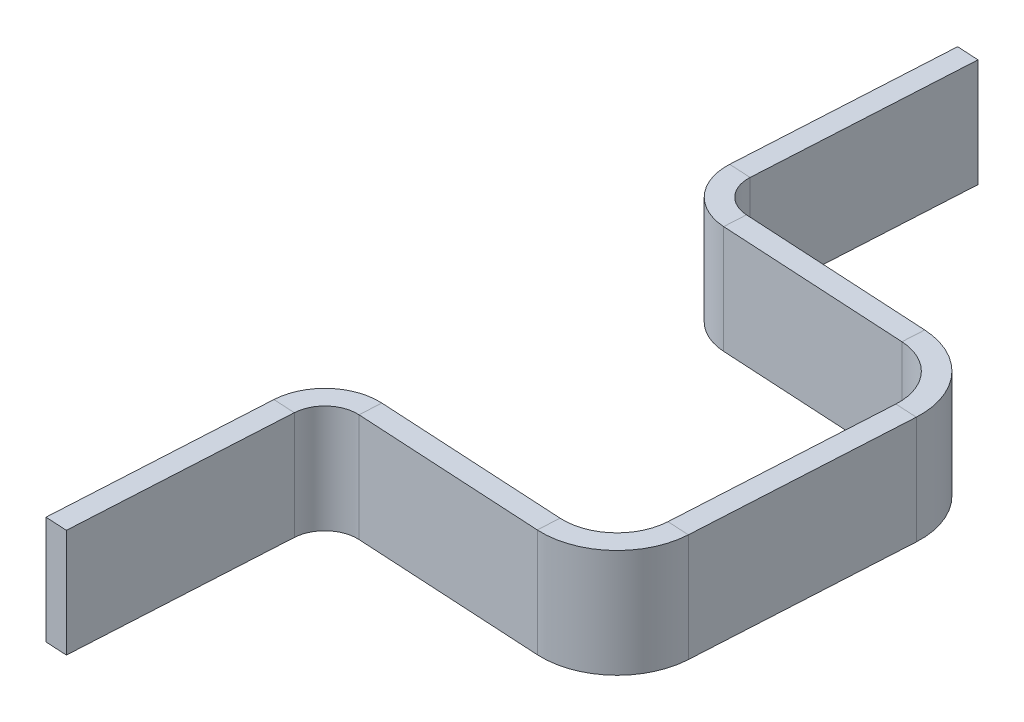
ISO-10303-21;
HEADER;
FILE_DESCRIPTION(('STEP AP214'),'2;1');
FILE_NAME('part.step','',(''),(''),'','','');
FILE_SCHEMA(('AUTOMOTIVE_DESIGN { 1 0 10303 214 1 1 1 1 }'));
ENDSEC;
DATA;
#1=APPLICATION_CONTEXT('core data for automotive mechanical design processes');
#2=APPLICATION_PROTOCOL_DEFINITION('international standard','automotive_design',2000,#1);
#3=PRODUCT_CONTEXT('',#1,'mechanical');
#4=PRODUCT('Part','Part','',(#3));
#5=PRODUCT_RELATED_PRODUCT_CATEGORY('part','',(#4));
#6=PRODUCT_DEFINITION_FORMATION('','',#4);
#7=PRODUCT_DEFINITION_CONTEXT('part definition',#1,'design');
#8=PRODUCT_DEFINITION('design','',#6,#7);
#9=PRODUCT_DEFINITION_SHAPE('','',#8);
#10=(LENGTH_UNIT() NAMED_UNIT(*) SI_UNIT(.MILLI.,.METRE.));
#11=(NAMED_UNIT(*) PLANE_ANGLE_UNIT() SI_UNIT($,.RADIAN.));
#12=(NAMED_UNIT(*) SI_UNIT($,.STERADIAN.) SOLID_ANGLE_UNIT());
#13=UNCERTAINTY_MEASURE_WITH_UNIT(LENGTH_MEASURE(1.E-05),#10,'distance_accuracy_value','');
#14=(GEOMETRIC_REPRESENTATION_CONTEXT(3) GLOBAL_UNCERTAINTY_ASSIGNED_CONTEXT((#13)) GLOBAL_UNIT_ASSIGNED_CONTEXT((#10,
#11,#12)) REPRESENTATION_CONTEXT('',''));
#15=CARTESIAN_POINT('',(0.,0.,0.));
#16=DIRECTION('',(0.,0.,1.));
#17=DIRECTION('',(1.,0.,0.));
#18=AXIS2_PLACEMENT_3D('',#15,#16,#17);
#19=CARTESIAN_POINT('',(12.7812392714854,20.,-49.3623330352713));
#20=DIRECTION('',(0.,1.,0.));
#21=DIRECTION('',(0.,0.,1.));
#22=AXIS2_PLACEMENT_3D('',#19,#20,#21);
#23=PLANE('',#22);
#24=DIRECTION('',(-0.0559379358544449,0.,0.998434247876315));
#25=VECTOR('',#24,1.);
#26=CARTESIAN_POINT('',(12.7812392714854,20.,-49.3623330352713));
#27=LINE('',#26,#25);
#28=CARTESIAN_POINT('',(12.7812392714854,20.,-49.3623330352713));
#29=VERTEX_POINT('',#28);
#30=CARTESIAN_POINT('',(12.5574875280677,20.,-45.3685960437661));
#31=VERTEX_POINT('',#30);
#32=EDGE_CURVE('E11',#29,#31,#27,.T.);
#33=ORIENTED_EDGE('',*,*,#32,.F.);
#34=CARTESIAN_POINT('',(12.221859912941,20.,-39.3779905565082));
#35=DIRECTION('',(0.,-1.,0.));
#36=DIRECTION('',(0.,0.,-1.));
#37=AXIS2_PLACEMENT_3D('',#34,#35,#36);
#38=CIRCLE('',#37,10.);
#39=CARTESIAN_POINT('',(2.23751743417784,20.,-39.9373699150526));
#40=VERTEX_POINT('',#39);
#41=EDGE_CURVE('E368',#40,#29,#38,.T.);
#42=ORIENTED_EDGE('',*,*,#41,.F.);
#43=DIRECTION('',(-0.998434247876316,0.,-0.055937935854445));
#44=VECTOR('',#43,1.);
#45=CARTESIAN_POINT('',(6.2312544256831,20.,-39.7136181716348));
#46=LINE('',#45,#44);
#47=CARTESIAN_POINT('',(6.2312544256831,20.,-39.7136181716348));
#48=VERTEX_POINT('',#47);
#49=EDGE_CURVE('E47',#48,#40,#46,.T.);
#50=ORIENTED_EDGE('',*,*,#49,.F.);
#51=CARTESIAN_POINT('',(12.221859912941,20.,-39.3779905565082));
#52=DIRECTION('',(0.,1.,0.));
#53=DIRECTION('',(1.,0.,0.));
#54=AXIS2_PLACEMENT_3D('',#51,#52,#53);
#55=CIRCLE('',#54,6.);
#56=EDGE_CURVE('E381',#48,#31,#55,.F.);
#57=ORIENTED_EDGE('',*,*,#56,.T.);
#58=EDGE_LOOP('',(#33,#42,#50,#57));
#59=FACE_BOUND('',#58,.T.);
#60=ADVANCED_FACE('F39',(#59),#23,.T.);
#61=CARTESIAN_POINT('',(6.2312544256831,20.,-39.7136181716348));
#62=DIRECTION('',(0.,1.,0.));
#63=DIRECTION('',(0.,0.,1.));
#64=AXIS2_PLACEMENT_3D('',#61,#62,#63);
#65=PLANE('',#64);
#66=DIRECTION('',(0.998434247876316,0.,0.0559379358544451));
#67=VECTOR('',#66,1.);
#68=CARTESIAN_POINT('',(12.7812392714855,20.,-49.3623330352713));
#69=LINE('',#68,#67);
#70=CARTESIAN_POINT('',(47.7264379471565,20.,-47.4045052803657));
#71=VERTEX_POINT('',#70);
#72=EDGE_CURVE('E372',#29,#71,#69,.T.);
#73=ORIENTED_EDGE('',*,*,#72,.F.);
#74=ORIENTED_EDGE('',*,*,#32,.T.);
#75=DIRECTION('',(0.998434247876316,0.,0.0559379358544451));
#76=VECTOR('',#75,1.);
#77=CARTESIAN_POINT('',(12.5574875280677,20.,-45.3685960437661));
#78=LINE('',#77,#76);
#79=CARTESIAN_POINT('',(47.5026862037387,20.,-43.4107682888605));
#80=VERTEX_POINT('',#79);
#81=EDGE_CURVE('E383',#31,#80,#78,.T.);
#82=ORIENTED_EDGE('',*,*,#81,.T.);
#83=DIRECTION('',(0.0559379358544464,0.,-0.998434247876315));
#84=VECTOR('',#83,1.);
#85=CARTESIAN_POINT('',(47.5026862037387,20.,-43.4107682888605));
#86=LINE('',#85,#84);
#87=EDGE_CURVE('E342',#80,#71,#86,.T.);
#88=ORIENTED_EDGE('',*,*,#87,.T.);
#89=EDGE_LOOP('',(#73,#74,#82,#88));
#90=FACE_BOUND('',#89,.T.);
#91=ADVANCED_FACE('F452',(#90),#65,.T.);
#92=CARTESIAN_POINT('',(2.23751743417784,0.,-39.9373699150526));
#93=DIRECTION('',(0.,-1.,0.));
#94=DIRECTION('',(0.,0.,-1.));
#95=AXIS2_PLACEMENT_3D('',#92,#93,#94);
#96=PLANE('',#95);
#97=DIRECTION('',(0.998434247876316,0.,0.055937935854445));
#98=VECTOR('',#97,1.);
#99=CARTESIAN_POINT('',(2.23751743417784,0.,-39.9373699150526));
#100=LINE('',#99,#98);
#101=CARTESIAN_POINT('',(2.23751743417784,0.,-39.9373699150526));
#102=VERTEX_POINT('',#101);
#103=CARTESIAN_POINT('',(6.2312544256831,0.,-39.7136181716348));
#104=VERTEX_POINT('',#103);
#105=EDGE_CURVE('E348',#102,#104,#100,.T.);
#106=ORIENTED_EDGE('',*,*,#105,.F.);
#107=CARTESIAN_POINT('',(12.221859912941,0.,-39.3779905565082));
#108=DIRECTION('',(0.,-1.,0.));
#109=DIRECTION('',(0.,0.,-1.));
#110=AXIS2_PLACEMENT_3D('',#107,#108,#109);
#111=CIRCLE('',#110,10.);
#112=CARTESIAN_POINT('',(12.7812392714854,0.,-49.3623330352713));
#113=VERTEX_POINT('',#112);
#114=EDGE_CURVE('E252',#102,#113,#111,.T.);
#115=ORIENTED_EDGE('',*,*,#114,.T.);
#116=DIRECTION('',(0.0559379358544449,0.,-0.998434247876315));
#117=VECTOR('',#116,1.);
#118=CARTESIAN_POINT('',(12.5574875280677,0.,-45.3685960437661));
#119=LINE('',#118,#117);
#120=CARTESIAN_POINT('',(12.5574875280677,0.,-45.3685960437661));
#121=VERTEX_POINT('',#120);
#122=EDGE_CURVE('E346',#121,#113,#119,.T.);
#123=ORIENTED_EDGE('',*,*,#122,.F.);
#124=CARTESIAN_POINT('',(12.221859912941,0.,-39.3779905565082));
#125=DIRECTION('',(0.,1.,0.));
#126=DIRECTION('',(1.,0.,0.));
#127=AXIS2_PLACEMENT_3D('',#124,#125,#126);
#128=CIRCLE('',#127,6.);
#129=EDGE_CURVE('E264',#104,#121,#128,.F.);
#130=ORIENTED_EDGE('',*,*,#129,.F.);
#131=EDGE_LOOP('',(#106,#115,#123,#130));
#132=FACE_BOUND('',#131,.T.);
#133=ADVANCED_FACE('F494',(#132),#96,.T.);
#134=CARTESIAN_POINT('',(12.5574875280677,0.,-45.3685960437661));
#135=DIRECTION('',(0.,-1.,0.));
#136=DIRECTION('',(0.,0.,-1.));
#137=AXIS2_PLACEMENT_3D('',#134,#135,#136);
#138=PLANE('',#137);
#139=DIRECTION('',(0.055937935854446,0.,-0.998434247876316));
#140=VECTOR('',#139,1.);
#141=CARTESIAN_POINT('',(0.,0.,0.));
#142=LINE('',#141,#140);
#143=CARTESIAN_POINT('',(0.,0.,0.));
#144=VERTEX_POINT('',#143);
#145=EDGE_CURVE('E255',#144,#102,#142,.T.);
#146=ORIENTED_EDGE('',*,*,#145,.T.);
#147=ORIENTED_EDGE('',*,*,#105,.T.);
#148=DIRECTION('',(0.055937935854446,0.,-0.998434247876316));
#149=VECTOR('',#148,1.);
#150=CARTESIAN_POINT('',(3.99373699150526,0.,0.223751743417784));
#151=LINE('',#150,#149);
#152=CARTESIAN_POINT('',(3.99373699150526,0.,0.223751743417784));
#153=VERTEX_POINT('',#152);
#154=EDGE_CURVE('E261',#153,#104,#151,.T.);
#155=ORIENTED_EDGE('',*,*,#154,.F.);
#156=DIRECTION('',(-0.998434247876316,0.,-0.055937935854446));
#157=VECTOR('',#156,1.);
#158=CARTESIAN_POINT('',(3.99373699150526,0.,0.223751743417784));
#159=LINE('',#158,#157);
#160=EDGE_CURVE('E258',#153,#144,#159,.T.);
#161=ORIENTED_EDGE('',*,*,#160,.T.);
#162=EDGE_LOOP('',(#146,#147,#155,#161));
#163=FACE_BOUND('',#162,.T.);
#164=ADVANCED_FACE('F498',(#163),#138,.T.);
#165=CARTESIAN_POINT('',(58.2701597844641,20.,-56.8294684005844));
#166=DIRECTION('',(0.,1.,0.));
#167=DIRECTION('',(0.,0.,1.));
#168=AXIS2_PLACEMENT_3D('',#165,#166,#167);
#169=PLANE('',#168);
#170=DIRECTION('',(0.998434247876315,0.,0.0559379358544446));
#171=VECTOR('',#170,1.);
#172=CARTESIAN_POINT('',(58.2701597844641,20.,-56.8294684005844));
#173=LINE('',#172,#171);
#174=CARTESIAN_POINT('',(58.2701597844641,20.,-56.8294684005844));
#175=VERTEX_POINT('',#174);
#176=CARTESIAN_POINT('',(62.2638967759694,20.,-56.6057166571666));
#177=VERTEX_POINT('',#176);
#178=EDGE_CURVE('E344',#175,#177,#173,.T.);
#179=ORIENTED_EDGE('',*,*,#178,.F.);
#180=CARTESIAN_POINT('',(48.285817305701,20.,-57.3888477591289));
#181=DIRECTION('',(0.,1.,0.));
#182=DIRECTION('',(0.,0.,1.));
#183=AXIS2_PLACEMENT_3D('',#180,#181,#182);
#184=CIRCLE('',#183,9.99999999999997);
#185=EDGE_CURVE('E442',#71,#175,#184,.T.);
#186=ORIENTED_EDGE('',*,*,#185,.F.);
#187=ORIENTED_EDGE('',*,*,#87,.F.);
#188=CARTESIAN_POINT('',(48.285817305701,20.,-57.3888477591289));
#189=DIRECTION('',(0.,1.,0.));
#190=DIRECTION('',(1.,0.,0.));
#191=AXIS2_PLACEMENT_3D('',#188,#189,#190);
#192=CIRCLE('',#191,14.);
#193=EDGE_CURVE('E386',#80,#177,#192,.T.);
#194=ORIENTED_EDGE('',*,*,#193,.T.);
#195=EDGE_LOOP('',(#179,#186,#187,#194));
#196=FACE_BOUND('',#195,.T.);
#197=ADVANCED_FACE('F459',(#196),#169,.T.);
#198=CARTESIAN_POINT('',(47.5026862037387,20.,-43.4107682888605));
#199=DIRECTION('',(0.,1.,0.));
#200=DIRECTION('',(0.,0.,1.));
#201=AXIS2_PLACEMENT_3D('',#198,#199,#200);
#202=PLANE('',#201);
#203=DIRECTION('',(0.0559379358544455,0.,-0.998434247876316));
#204=VECTOR('',#203,1.);
#205=CARTESIAN_POINT('',(58.2701597844641,20.,-56.8294684005844));
#206=LINE('',#205,#204);
#207=CARTESIAN_POINT('',(60.5076772186419,20.,-96.766838315637));
#208=VERTEX_POINT('',#207);
#209=EDGE_CURVE('E439',#175,#208,#206,.T.);
#210=ORIENTED_EDGE('',*,*,#209,.F.);
#211=ORIENTED_EDGE('',*,*,#178,.T.);
#212=DIRECTION('',(0.0559379358544455,0.,-0.998434247876316));
#213=VECTOR('',#212,1.);
#214=CARTESIAN_POINT('',(62.2638967759694,20.,-56.6057166571666));
#215=LINE('',#214,#213);
#216=CARTESIAN_POINT('',(64.5014142101472,20.,-96.5430865722192));
#217=VERTEX_POINT('',#216);
#218=EDGE_CURVE('E206',#177,#217,#215,.T.);
#219=ORIENTED_EDGE('',*,*,#218,.T.);
#220=DIRECTION('',(-0.998434247876316,0.,-0.0559379358544451));
#221=VECTOR('',#220,1.);
#222=CARTESIAN_POINT('',(64.5014142101472,20.,-96.5430865722192));
#223=LINE('',#222,#221);
#224=EDGE_CURVE('E197',#217,#208,#223,.T.);
#225=ORIENTED_EDGE('',*,*,#224,.T.);
#226=EDGE_LOOP('',(#210,#211,#219,#225));
#227=FACE_BOUND('',#226,.T.);
#228=ADVANCED_FACE('F392',(#227),#202,.T.);
#229=CARTESIAN_POINT('',(47.7264379471565,0.,-47.4045052803657));
#230=DIRECTION('',(0.,-1.,0.));
#231=DIRECTION('',(0.,0.,-1.));
#232=AXIS2_PLACEMENT_3D('',#229,#230,#231);
#233=PLANE('',#232);
#234=DIRECTION('',(-0.0559379358544464,0.,0.998434247876315));
#235=VECTOR('',#234,1.);
#236=CARTESIAN_POINT('',(47.7264379471565,0.,-47.4045052803657));
#237=LINE('',#236,#235);
#238=CARTESIAN_POINT('',(47.7264379471565,0.,-47.4045052803657));
#239=VERTEX_POINT('',#238);
#240=CARTESIAN_POINT('',(47.5026862037387,0.,-43.4107682888605));
#241=VERTEX_POINT('',#240);
#242=EDGE_CURVE('E340',#239,#241,#237,.T.);
#243=ORIENTED_EDGE('',*,*,#242,.F.);
#244=CARTESIAN_POINT('',(48.285817305701,0.,-57.3888477591289));
#245=DIRECTION('',(0.,1.,0.));
#246=DIRECTION('',(0.,0.,1.));
#247=AXIS2_PLACEMENT_3D('',#244,#245,#246);
#248=CIRCLE('',#247,9.99999999999997);
#249=CARTESIAN_POINT('',(58.2701597844641,0.,-56.8294684005844));
#250=VERTEX_POINT('',#249);
#251=EDGE_CURVE('E246',#239,#250,#248,.T.);
#252=ORIENTED_EDGE('',*,*,#251,.T.);
#253=DIRECTION('',(-0.998434247876315,0.,-0.0559379358544446));
#254=VECTOR('',#253,1.);
#255=CARTESIAN_POINT('',(62.2638967759694,0.,-56.6057166571666));
#256=LINE('',#255,#254);
#257=CARTESIAN_POINT('',(62.2638967759694,0.,-56.6057166571666));
#258=VERTEX_POINT('',#257);
#259=EDGE_CURVE('E196',#258,#250,#256,.T.);
#260=ORIENTED_EDGE('',*,*,#259,.F.);
#261=CARTESIAN_POINT('',(48.285817305701,0.,-57.3888477591289));
#262=DIRECTION('',(0.,1.,0.));
#263=DIRECTION('',(1.,0.,0.));
#264=AXIS2_PLACEMENT_3D('',#261,#262,#263);
#265=CIRCLE('',#264,14.);
#266=EDGE_CURVE('E270',#241,#258,#265,.T.);
#267=ORIENTED_EDGE('',*,*,#266,.F.);
#268=EDGE_LOOP('',(#243,#252,#260,#267));
#269=FACE_BOUND('',#268,.T.);
#270=ADVANCED_FACE('F468',(#269),#233,.T.);
#271=CARTESIAN_POINT('',(62.2638967759694,0.,-56.6057166571666));
#272=DIRECTION('',(0.,-1.,0.));
#273=DIRECTION('',(0.,0.,-1.));
#274=AXIS2_PLACEMENT_3D('',#271,#272,#273);
#275=PLANE('',#274);
#276=DIRECTION('',(0.998434247876316,0.,0.0559379358544451));
#277=VECTOR('',#276,1.);
#278=CARTESIAN_POINT('',(12.7812392714855,0.,-49.3623330352713));
#279=LINE('',#278,#277);
#280=EDGE_CURVE('E249',#113,#239,#279,.T.);
#281=ORIENTED_EDGE('',*,*,#280,.T.);
#282=ORIENTED_EDGE('',*,*,#242,.T.);
#283=DIRECTION('',(0.998434247876316,0.,0.0559379358544451));
#284=VECTOR('',#283,1.);
#285=CARTESIAN_POINT('',(12.5574875280677,0.,-45.3685960437661));
#286=LINE('',#285,#284);
#287=EDGE_CURVE('E267',#121,#241,#286,.T.);
#288=ORIENTED_EDGE('',*,*,#287,.F.);
#289=ORIENTED_EDGE('',*,*,#122,.T.);
#290=EDGE_LOOP('',(#281,#282,#288,#289));
#291=FACE_BOUND('',#290,.T.);
#292=ADVANCED_FACE('F472',(#291),#275,.T.);
#293=CARTESIAN_POINT('',(51.0827140984232,20.,-107.310560152945));
#294=DIRECTION('',(0.,1.,0.));
#295=DIRECTION('',(0.,0.,1.));
#296=AXIS2_PLACEMENT_3D('',#293,#294,#295);
#297=PLANE('',#296);
#298=DIRECTION('',(0.0559379358544469,0.,-0.998434247876316));
#299=VECTOR('',#298,1.);
#300=CARTESIAN_POINT('',(51.0827140984232,20.,-107.310560152945));
#301=LINE('',#300,#299);
#302=CARTESIAN_POINT('',(51.0827140984232,20.,-107.310560152945));
#303=VERTEX_POINT('',#302);
#304=CARTESIAN_POINT('',(51.306465841841,20.,-111.30429714445));
#305=VERTEX_POINT('',#304);
#306=EDGE_CURVE('E184',#303,#305,#301,.T.);
#307=ORIENTED_EDGE('',*,*,#306,.F.);
#308=CARTESIAN_POINT('',(50.5233347398788,20.,-97.3262176741814));
#309=DIRECTION('',(0.,1.,0.));
#310=DIRECTION('',(0.,0.,1.));
#311=AXIS2_PLACEMENT_3D('',#308,#309,#310);
#312=CIRCLE('',#311,9.99999999999998);
#313=EDGE_CURVE('E404',#208,#303,#312,.T.);
#314=ORIENTED_EDGE('',*,*,#313,.F.);
#315=ORIENTED_EDGE('',*,*,#224,.F.);
#316=CARTESIAN_POINT('',(50.5233347398788,20.,-97.3262176741814));
#317=DIRECTION('',(0.,1.,0.));
#318=DIRECTION('',(1.,0.,0.));
#319=AXIS2_PLACEMENT_3D('',#316,#317,#318);
#320=CIRCLE('',#319,14.);
#321=EDGE_CURVE('E200',#217,#305,#320,.T.);
#322=ORIENTED_EDGE('',*,*,#321,.T.);
#323=EDGE_LOOP('',(#307,#314,#315,#322));
#324=FACE_BOUND('',#323,.T.);
#325=ADVANCED_FACE('F202',(#324),#297,.T.);
#326=CARTESIAN_POINT('',(64.5014142101472,20.,-96.5430865722192));
#327=DIRECTION('',(0.,1.,0.));
#328=DIRECTION('',(0.,0.,1.));
#329=AXIS2_PLACEMENT_3D('',#326,#327,#328);
#330=PLANE('',#329);
#331=DIRECTION('',(-0.998434247876316,0.,-0.0559379358544459));
#332=VECTOR('',#331,1.);
#333=CARTESIAN_POINT('',(51.0827140984232,20.,-107.310560152945));
#334=LINE('',#333,#332);
#335=CARTESIAN_POINT('',(16.1375154227522,20.,-109.26838790785));
#336=VERTEX_POINT('',#335);
#337=EDGE_CURVE('E191',#303,#336,#334,.T.);
#338=ORIENTED_EDGE('',*,*,#337,.F.);
#339=ORIENTED_EDGE('',*,*,#306,.T.);
#340=DIRECTION('',(-0.998434247876316,0.,-0.0559379358544459));
#341=VECTOR('',#340,1.);
#342=CARTESIAN_POINT('',(51.306465841841,20.,-111.30429714445));
#343=LINE('',#342,#341);
#344=CARTESIAN_POINT('',(16.36126716617,20.,-113.262124899355));
#345=VERTEX_POINT('',#344);
#346=EDGE_CURVE('E188',#305,#345,#343,.T.);
#347=ORIENTED_EDGE('',*,*,#346,.T.);
#348=DIRECTION('',(-0.0559379358544449,0.,0.998434247876315));
#349=VECTOR('',#348,1.);
#350=CARTESIAN_POINT('',(16.36126716617,20.,-113.262124899355));
#351=LINE('',#350,#349);
#352=EDGE_CURVE('E331',#345,#336,#351,.T.);
#353=ORIENTED_EDGE('',*,*,#352,.T.);
#354=EDGE_LOOP('',(#338,#339,#347,#353));
#355=FACE_BOUND('',#354,.T.);
#356=ADVANCED_FACE('F186',(#355),#330,.T.);
#357=CARTESIAN_POINT('',(60.5076772186419,0.,-96.766838315637));
#358=DIRECTION('',(0.,-1.,0.));
#359=DIRECTION('',(0.,0.,-1.));
#360=AXIS2_PLACEMENT_3D('',#357,#358,#359);
#361=PLANE('',#360);
#362=DIRECTION('',(0.998434247876316,0.,0.0559379358544451));
#363=VECTOR('',#362,1.);
#364=CARTESIAN_POINT('',(60.5076772186419,0.,-96.766838315637));
#365=LINE('',#364,#363);
#366=CARTESIAN_POINT('',(60.5076772186419,0.,-96.766838315637));
#367=VERTEX_POINT('',#366);
#368=CARTESIAN_POINT('',(64.5014142101472,0.,-96.5430865722192));
#369=VERTEX_POINT('',#368);
#370=EDGE_CURVE('E336',#367,#369,#365,.T.);
#371=ORIENTED_EDGE('',*,*,#370,.F.);
#372=CARTESIAN_POINT('',(50.5233347398788,0.,-97.3262176741814));
#373=DIRECTION('',(0.,1.,0.));
#374=DIRECTION('',(0.,0.,1.));
#375=AXIS2_PLACEMENT_3D('',#372,#373,#374);
#376=CIRCLE('',#375,9.99999999999998);
#377=CARTESIAN_POINT('',(51.0827140984232,0.,-107.310560152945));
#378=VERTEX_POINT('',#377);
#379=EDGE_CURVE('E240',#367,#378,#376,.T.);
#380=ORIENTED_EDGE('',*,*,#379,.T.);
#381=DIRECTION('',(-0.0559379358544469,0.,0.998434247876316));
#382=VECTOR('',#381,1.);
#383=CARTESIAN_POINT('',(51.306465841841,0.,-111.30429714445));
#384=LINE('',#383,#382);
#385=CARTESIAN_POINT('',(51.306465841841,0.,-111.30429714445));
#386=VERTEX_POINT('',#385);
#387=EDGE_CURVE('E334',#386,#378,#384,.T.);
#388=ORIENTED_EDGE('',*,*,#387,.F.);
#389=CARTESIAN_POINT('',(50.5233347398788,0.,-97.3262176741814));
#390=DIRECTION('',(0.,1.,0.));
#391=DIRECTION('',(1.,0.,0.));
#392=AXIS2_PLACEMENT_3D('',#389,#390,#391);
#393=CIRCLE('',#392,14.);
#394=EDGE_CURVE('E213',#369,#386,#393,.T.);
#395=ORIENTED_EDGE('',*,*,#394,.F.);
#396=EDGE_LOOP('',(#371,#380,#388,#395));
#397=FACE_BOUND('',#396,.T.);
#398=ADVANCED_FACE('F398',(#397),#361,.T.);
#399=CARTESIAN_POINT('',(51.306465841841,0.,-111.30429714445));
#400=DIRECTION('',(0.,-1.,0.));
#401=DIRECTION('',(0.,0.,-1.));
#402=AXIS2_PLACEMENT_3D('',#399,#400,#401);
#403=PLANE('',#402);
#404=DIRECTION('',(0.0559379358544455,0.,-0.998434247876316));
#405=VECTOR('',#404,1.);
#406=CARTESIAN_POINT('',(58.2701597844641,0.,-56.8294684005844));
#407=LINE('',#406,#405);
#408=EDGE_CURVE('E243',#250,#367,#407,.T.);
#409=ORIENTED_EDGE('',*,*,#408,.T.);
#410=ORIENTED_EDGE('',*,*,#370,.T.);
#411=DIRECTION('',(0.0559379358544455,0.,-0.998434247876316));
#412=VECTOR('',#411,1.);
#413=CARTESIAN_POINT('',(62.2638967759694,0.,-56.6057166571666));
#414=LINE('',#413,#412);
#415=EDGE_CURVE('E273',#258,#369,#414,.T.);
#416=ORIENTED_EDGE('',*,*,#415,.F.);
#417=ORIENTED_EDGE('',*,*,#259,.T.);
#418=EDGE_LOOP('',(#409,#410,#416,#417));
#419=FACE_BOUND('',#418,.T.);
#420=ADVANCED_FACE('F478',(#419),#403,.T.);
#421=CARTESIAN_POINT('',(6.71255230253349,20.,-119.812109745158));
#422=DIRECTION('',(0.,1.,0.));
#423=DIRECTION('',(0.,0.,1.));
#424=AXIS2_PLACEMENT_3D('',#421,#422,#423);
#425=PLANE('',#424);
#426=DIRECTION('',(0.998434247876316,0.,0.0559379358544451));
#427=VECTOR('',#426,1.);
#428=CARTESIAN_POINT('',(6.71255230253349,20.,-119.812109745158));
#429=LINE('',#428,#427);
#430=CARTESIAN_POINT('',(6.71255230253349,20.,-119.812109745158));
#431=VERTEX_POINT('',#430);
#432=CARTESIAN_POINT('',(10.7062892940388,20.,-119.58835800174));
#433=VERTEX_POINT('',#432);
#434=EDGE_CURVE('E55',#431,#433,#429,.T.);
#435=ORIENTED_EDGE('',*,*,#434,.F.);
#436=CARTESIAN_POINT('',(16.6968947812966,20.,-119.252730386613));
#437=DIRECTION('',(0.,-1.,0.));
#438=DIRECTION('',(0.,0.,-1.));
#439=AXIS2_PLACEMENT_3D('',#436,#437,#438);
#440=CIRCLE('',#439,9.99999999999999);
#441=EDGE_CURVE('E432',#336,#431,#440,.T.);
#442=ORIENTED_EDGE('',*,*,#441,.F.);
#443=ORIENTED_EDGE('',*,*,#352,.F.);
#444=CARTESIAN_POINT('',(16.6968947812966,20.,-119.252730386613));
#445=DIRECTION('',(0.,1.,0.));
#446=DIRECTION('',(1.,0.,0.));
#447=AXIS2_PLACEMENT_3D('',#444,#445,#446);
#448=CIRCLE('',#447,5.99999999999999);
#449=EDGE_CURVE('E221',#345,#433,#448,.F.);
#450=ORIENTED_EDGE('',*,*,#449,.T.);
#451=EDGE_LOOP('',(#435,#442,#443,#450));
#452=FACE_BOUND('',#451,.T.);
#453=ADVANCED_FACE('F480',(#452),#425,.T.);
#454=CARTESIAN_POINT('',(16.36126716617,20.,-113.262124899355));
#455=DIRECTION('',(0.,1.,0.));
#456=DIRECTION('',(0.,0.,1.));
#457=AXIS2_PLACEMENT_3D('',#454,#455,#456);
#458=PLANE('',#457);
#459=DIRECTION('',(0.0559379358544461,0.,-0.998434247876316));
#460=VECTOR('',#459,1.);
#461=CARTESIAN_POINT('',(6.71255230253349,20.,-119.812109745158));
#462=LINE('',#461,#460);
#463=CARTESIAN_POINT('',(8.95006973671133,20.,-159.74947966021));
#464=VERTEX_POINT('',#463);
#465=EDGE_CURVE('E430',#431,#464,#462,.T.);
#466=ORIENTED_EDGE('',*,*,#465,.F.);
#467=ORIENTED_EDGE('',*,*,#434,.T.);
#468=DIRECTION('',(0.0559379358544461,0.,-0.998434247876316));
#469=VECTOR('',#468,1.);
#470=CARTESIAN_POINT('',(10.7062892940388,20.,-119.58835800174));
#471=LINE('',#470,#469);
#472=CARTESIAN_POINT('',(12.9438067282166,20.,-159.525727916793));
#473=VERTEX_POINT('',#472);
#474=EDGE_CURVE('E133',#433,#473,#471,.T.);
#475=ORIENTED_EDGE('',*,*,#474,.T.);
#476=DIRECTION('',(0.998434247876316,0.,0.0559379358544485));
#477=VECTOR('',#476,1.);
#478=CARTESIAN_POINT('',(8.95006973671133,20.,-159.74947966021));
#479=LINE('',#478,#477);
#480=EDGE_CURVE('E428',#464,#473,#479,.T.);
#481=ORIENTED_EDGE('',*,*,#480,.F.);
#482=EDGE_LOOP('',(#466,#467,#475,#481));
#483=FACE_BOUND('',#482,.T.);
#484=ADVANCED_FACE('F486',(#483),#458,.T.);
#485=CARTESIAN_POINT('',(16.1375154227522,0.,-109.26838790785));
#486=DIRECTION('',(0.,-1.,0.));
#487=DIRECTION('',(0.,0.,-1.));
#488=AXIS2_PLACEMENT_3D('',#485,#486,#487);
#489=PLANE('',#488);
#490=DIRECTION('',(0.0559379358544449,0.,-0.998434247876315));
#491=VECTOR('',#490,1.);
#492=CARTESIAN_POINT('',(16.1375154227522,0.,-109.26838790785));
#493=LINE('',#492,#491);
#494=CARTESIAN_POINT('',(16.1375154227522,0.,-109.26838790785));
#495=VERTEX_POINT('',#494);
#496=CARTESIAN_POINT('',(16.36126716617,0.,-113.262124899355));
#497=VERTEX_POINT('',#496);
#498=EDGE_CURVE('E120',#495,#497,#493,.T.);
#499=ORIENTED_EDGE('',*,*,#498,.F.);
#500=CARTESIAN_POINT('',(16.6968947812966,0.,-119.252730386613));
#501=DIRECTION('',(0.,-1.,0.));
#502=DIRECTION('',(0.,0.,-1.));
#503=AXIS2_PLACEMENT_3D('',#500,#501,#502);
#504=CIRCLE('',#503,9.99999999999999);
#505=CARTESIAN_POINT('',(6.71255230253349,0.,-119.812109745158));
#506=VERTEX_POINT('',#505);
#507=EDGE_CURVE('E236',#495,#506,#504,.T.);
#508=ORIENTED_EDGE('',*,*,#507,.T.);
#509=DIRECTION('',(-0.998434247876316,0.,-0.0559379358544451));
#510=VECTOR('',#509,1.);
#511=CARTESIAN_POINT('',(10.7062892940388,0.,-119.58835800174));
#512=LINE('',#511,#510);
#513=CARTESIAN_POINT('',(10.7062892940388,0.,-119.58835800174));
#514=VERTEX_POINT('',#513);
#515=EDGE_CURVE('E127',#514,#506,#512,.T.);
#516=ORIENTED_EDGE('',*,*,#515,.F.);
#517=CARTESIAN_POINT('',(16.6968947812966,0.,-119.252730386613));
#518=DIRECTION('',(0.,1.,0.));
#519=DIRECTION('',(1.,0.,0.));
#520=AXIS2_PLACEMENT_3D('',#517,#518,#519);
#521=CIRCLE('',#520,5.99999999999999);
#522=EDGE_CURVE('E279',#497,#514,#521,.F.);
#523=ORIENTED_EDGE('',*,*,#522,.F.);
#524=EDGE_LOOP('',(#499,#508,#516,#523));
#525=FACE_BOUND('',#524,.T.);
#526=ADVANCED_FACE('F415',(#525),#489,.T.);
#527=CARTESIAN_POINT('',(10.7062892940388,0.,-119.58835800174));
#528=DIRECTION('',(0.,-1.,0.));
#529=DIRECTION('',(0.,0.,-1.));
#530=AXIS2_PLACEMENT_3D('',#527,#528,#529);
#531=PLANE('',#530);
#532=DIRECTION('',(-0.998434247876316,0.,-0.0559379358544459));
#533=VECTOR('',#532,1.);
#534=CARTESIAN_POINT('',(51.0827140984232,0.,-107.310560152945));
#535=LINE('',#534,#533);
#536=EDGE_CURVE('E238',#378,#495,#535,.T.);
#537=ORIENTED_EDGE('',*,*,#536,.T.);
#538=ORIENTED_EDGE('',*,*,#498,.T.);
#539=DIRECTION('',(-0.998434247876316,0.,-0.0559379358544459));
#540=VECTOR('',#539,1.);
#541=CARTESIAN_POINT('',(51.306465841841,0.,-111.30429714445));
#542=LINE('',#541,#540);
#543=EDGE_CURVE('E277',#386,#497,#542,.T.);
#544=ORIENTED_EDGE('',*,*,#543,.F.);
#545=ORIENTED_EDGE('',*,*,#387,.T.);
#546=EDGE_LOOP('',(#537,#538,#544,#545));
#547=FACE_BOUND('',#546,.T.);
#548=ADVANCED_FACE('F400',(#547),#531,.T.);
#549=CARTESIAN_POINT('',(10.7062892940388,20.,-119.58835800174));
#550=DIRECTION('',(-0.998434247876316,0.,-0.0559379358544461));
#551=DIRECTION('',(-0.0559379358544461,0.,0.998434247876316));
#552=AXIS2_PLACEMENT_3D('',#549,#550,#551);
#553=PLANE('',#552);
#554=DIRECTION('',(0.0559379358544461,0.,-0.998434247876316));
#555=VECTOR('',#554,1.);
#556=CARTESIAN_POINT('',(10.7062892940388,0.,-119.58835800174));
#557=LINE('',#556,#555);
#558=CARTESIAN_POINT('',(12.9438067282166,0.,-159.525727916793));
#559=VERTEX_POINT('',#558);
#560=EDGE_CURVE('E227',#514,#559,#557,.T.);
#561=ORIENTED_EDGE('',*,*,#560,.T.);
#562=DIRECTION('',(0.,-1.,0.));
#563=VECTOR('',#562,1.);
#564=CARTESIAN_POINT('',(12.9438067282166,20.,-159.525727916793));
#565=LINE('',#564,#563);
#566=EDGE_CURVE('E327',#473,#559,#565,.T.);
#567=ORIENTED_EDGE('',*,*,#566,.F.);
#568=ORIENTED_EDGE('',*,*,#474,.F.);
#569=DIRECTION('',(0.,-1.,0.));
#570=VECTOR('',#569,1.);
#571=CARTESIAN_POINT('',(10.7062892940388,20.,-119.58835800174));
#572=LINE('',#571,#570);
#573=EDGE_CURVE('E223',#433,#514,#572,.T.);
#574=ORIENTED_EDGE('',*,*,#573,.T.);
#575=EDGE_LOOP('',(#561,#567,#568,#574));
#576=FACE_BOUND('',#575,.T.);
#577=ADVANCED_FACE('F421',(#576),#553,.F.);
#578=CARTESIAN_POINT('',(8.95006973671133,20.,-159.74947966021));
#579=DIRECTION('',(0.0559379358544485,0.,-0.998434247876316));
#580=DIRECTION('',(-0.998434247876316,0.,-0.0559379358544485));
#581=AXIS2_PLACEMENT_3D('',#578,#579,#580);
#582=PLANE('',#581);
#583=DIRECTION('',(0.998434247876316,0.,0.0559379358544485));
#584=VECTOR('',#583,1.);
#585=CARTESIAN_POINT('',(8.95006973671133,0.,-159.74947966021));
#586=LINE('',#585,#584);
#587=CARTESIAN_POINT('',(8.95006973671133,0.,-159.74947966021));
#588=VERTEX_POINT('',#587);
#589=EDGE_CURVE('E230',#588,#559,#586,.T.);
#590=ORIENTED_EDGE('',*,*,#589,.F.);
#591=DIRECTION('',(0.,-1.,0.));
#592=VECTOR('',#591,1.);
#593=CARTESIAN_POINT('',(8.95006973671133,20.,-159.74947966021));
#594=LINE('',#593,#592);
#595=EDGE_CURVE('E325',#464,#588,#594,.T.);
#596=ORIENTED_EDGE('',*,*,#595,.F.);
#597=ORIENTED_EDGE('',*,*,#480,.T.);
#598=ORIENTED_EDGE('',*,*,#566,.T.);
#599=EDGE_LOOP('',(#590,#596,#597,#598));
#600=FACE_BOUND('',#599,.T.);
#601=ADVANCED_FACE('F426',(#600),#582,.T.);
#602=CARTESIAN_POINT('',(6.71255230253349,20.,-119.812109745158));
#603=DIRECTION('',(-0.998434247876316,0.,-0.0559379358544461));
#604=DIRECTION('',(-0.0559379358544461,0.,0.998434247876316));
#605=AXIS2_PLACEMENT_3D('',#602,#603,#604);
#606=PLANE('',#605);
#607=DIRECTION('',(0.0559379358544461,0.,-0.998434247876316));
#608=VECTOR('',#607,1.);
#609=CARTESIAN_POINT('',(6.71255230253349,0.,-119.812109745158));
#610=LINE('',#609,#608);
#611=EDGE_CURVE('E233',#506,#588,#610,.T.);
#612=ORIENTED_EDGE('',*,*,#611,.F.);
#613=DIRECTION('',(0.,-1.,0.));
#614=VECTOR('',#613,1.);
#615=CARTESIAN_POINT('',(6.71255230253349,20.,-119.812109745158));
#616=LINE('',#615,#614);
#617=EDGE_CURVE('E322',#431,#506,#616,.T.);
#618=ORIENTED_EDGE('',*,*,#617,.F.);
#619=ORIENTED_EDGE('',*,*,#465,.T.);
#620=ORIENTED_EDGE('',*,*,#595,.T.);
#621=EDGE_LOOP('',(#612,#618,#619,#620));
#622=FACE_BOUND('',#621,.T.);
#623=ADVANCED_FACE('F582',(#622),#606,.T.);
#624=CARTESIAN_POINT('',(16.6968947812966,20.,-119.252730386613));
#625=DIRECTION('',(0.,-1.,0.));
#626=DIRECTION('',(0.,0.,-1.));
#627=AXIS2_PLACEMENT_3D('',#624,#625,#626);
#628=CYLINDRICAL_SURFACE('',#627,9.99999999999999);
#629=ORIENTED_EDGE('',*,*,#507,.F.);
#630=DIRECTION('',(0.,-1.,0.));
#631=VECTOR('',#630,1.);
#632=CARTESIAN_POINT('',(16.1375154227522,20.,-109.26838790785));
#633=LINE('',#632,#631);
#634=EDGE_CURVE('E319',#336,#495,#633,.T.);
#635=ORIENTED_EDGE('',*,*,#634,.F.);
#636=ORIENTED_EDGE('',*,*,#441,.T.);
#637=ORIENTED_EDGE('',*,*,#617,.T.);
#638=EDGE_LOOP('',(#629,#635,#636,#637));
#639=FACE_BOUND('',#638,.T.);
#640=ADVANCED_FACE('F412',(#639),#628,.T.);
#641=CARTESIAN_POINT('',(51.0827140984232,20.,-107.310560152945));
#642=DIRECTION('',(-0.0559379358544459,0.,0.998434247876316));
#643=DIRECTION('',(0.998434247876316,0.,0.0559379358544459));
#644=AXIS2_PLACEMENT_3D('',#641,#642,#643);
#645=PLANE('',#644);
#646=ORIENTED_EDGE('',*,*,#536,.F.);
#647=DIRECTION('',(0.,-1.,0.));
#648=VECTOR('',#647,1.);
#649=CARTESIAN_POINT('',(51.0827140984232,20.,-107.310560152945));
#650=LINE('',#649,#648);
#651=EDGE_CURVE('E316',#303,#378,#650,.T.);
#652=ORIENTED_EDGE('',*,*,#651,.F.);
#653=ORIENTED_EDGE('',*,*,#337,.T.);
#654=ORIENTED_EDGE('',*,*,#634,.T.);
#655=EDGE_LOOP('',(#646,#652,#653,#654));
#656=FACE_BOUND('',#655,.T.);
#657=ADVANCED_FACE('F406',(#656),#645,.T.);
#658=CARTESIAN_POINT('',(50.5233347398788,20.,-97.3262176741814));
#659=DIRECTION('',(0.,-1.,0.));
#660=DIRECTION('',(0.,0.,-1.));
#661=AXIS2_PLACEMENT_3D('',#658,#659,#660);
#662=CYLINDRICAL_SURFACE('',#661,9.99999999999998);
#663=ORIENTED_EDGE('',*,*,#379,.F.);
#664=DIRECTION('',(0.,-1.,0.));
#665=VECTOR('',#664,1.);
#666=CARTESIAN_POINT('',(60.5076772186419,20.,-96.766838315637));
#667=LINE('',#666,#665);
#668=EDGE_CURVE('E313',#208,#367,#667,.T.);
#669=ORIENTED_EDGE('',*,*,#668,.F.);
#670=ORIENTED_EDGE('',*,*,#313,.T.);
#671=ORIENTED_EDGE('',*,*,#651,.T.);
#672=EDGE_LOOP('',(#663,#669,#670,#671));
#673=FACE_BOUND('',#672,.T.);
#674=ADVANCED_FACE('F403',(#673),#662,.F.);
#675=CARTESIAN_POINT('',(58.2701597844641,20.,-56.8294684005844));
#676=DIRECTION('',(-0.998434247876316,0.,-0.0559379358544455));
#677=DIRECTION('',(-0.0559379358544455,0.,0.998434247876316));
#678=AXIS2_PLACEMENT_3D('',#675,#676,#677);
#679=PLANE('',#678);
#680=ORIENTED_EDGE('',*,*,#408,.F.);
#681=DIRECTION('',(0.,-1.,0.));
#682=VECTOR('',#681,1.);
#683=CARTESIAN_POINT('',(58.2701597844641,20.,-56.8294684005844));
#684=LINE('',#683,#682);
#685=EDGE_CURVE('E310',#175,#250,#684,.T.);
#686=ORIENTED_EDGE('',*,*,#685,.F.);
#687=ORIENTED_EDGE('',*,*,#209,.T.);
#688=ORIENTED_EDGE('',*,*,#668,.T.);
#689=EDGE_LOOP('',(#680,#686,#687,#688));
#690=FACE_BOUND('',#689,.T.);
#691=ADVANCED_FACE('F465',(#690),#679,.T.);
#692=CARTESIAN_POINT('',(48.285817305701,20.,-57.3888477591289));
#693=DIRECTION('',(0.,-1.,0.));
#694=DIRECTION('',(0.,0.,-1.));
#695=AXIS2_PLACEMENT_3D('',#692,#693,#694);
#696=CYLINDRICAL_SURFACE('',#695,9.99999999999997);
#697=ORIENTED_EDGE('',*,*,#251,.F.);
#698=DIRECTION('',(0.,-1.,0.));
#699=VECTOR('',#698,1.);
#700=CARTESIAN_POINT('',(47.7264379471565,20.,-47.4045052803657));
#701=LINE('',#700,#699);
#702=EDGE_CURVE('E307',#71,#239,#701,.T.);
#703=ORIENTED_EDGE('',*,*,#702,.F.);
#704=ORIENTED_EDGE('',*,*,#185,.T.);
#705=ORIENTED_EDGE('',*,*,#685,.T.);
#706=EDGE_LOOP('',(#697,#703,#704,#705));
#707=FACE_BOUND('',#706,.T.);
#708=ADVANCED_FACE('F458',(#707),#696,.F.);
#709=CARTESIAN_POINT('',(12.7812392714855,20.,-49.3623330352713));
#710=DIRECTION('',(0.0559379358544451,0.,-0.998434247876316));
#711=DIRECTION('',(-0.998434247876316,0.,-0.0559379358544451));
#712=AXIS2_PLACEMENT_3D('',#709,#710,#711);
#713=PLANE('',#712);
#714=ORIENTED_EDGE('',*,*,#280,.F.);
#715=DIRECTION('',(0.,-1.,0.));
#716=VECTOR('',#715,1.);
#717=CARTESIAN_POINT('',(12.7812392714854,20.,-49.3623330352713));
#718=LINE('',#717,#716);
#719=EDGE_CURVE('E304',#29,#113,#718,.T.);
#720=ORIENTED_EDGE('',*,*,#719,.F.);
#721=ORIENTED_EDGE('',*,*,#72,.T.);
#722=ORIENTED_EDGE('',*,*,#702,.T.);
#723=EDGE_LOOP('',(#714,#720,#721,#722));
#724=FACE_BOUND('',#723,.T.);
#725=ADVANCED_FACE('F448',(#724),#713,.T.);
#726=CARTESIAN_POINT('',(12.221859912941,20.,-39.3779905565082));
#727=DIRECTION('',(0.,-1.,0.));
#728=DIRECTION('',(0.,0.,-1.));
#729=AXIS2_PLACEMENT_3D('',#726,#727,#728);
#730=CYLINDRICAL_SURFACE('',#729,10.);
#731=ORIENTED_EDGE('',*,*,#114,.F.);
#732=DIRECTION('',(0.,-1.,0.));
#733=VECTOR('',#732,1.);
#734=CARTESIAN_POINT('',(2.23751743417784,20.,-39.9373699150526));
#735=LINE('',#734,#733);
#736=EDGE_CURVE('E301',#40,#102,#735,.T.);
#737=ORIENTED_EDGE('',*,*,#736,.F.);
#738=ORIENTED_EDGE('',*,*,#41,.T.);
#739=ORIENTED_EDGE('',*,*,#719,.T.);
#740=EDGE_LOOP('',(#731,#737,#738,#739));
#741=FACE_BOUND('',#740,.T.);
#742=ADVANCED_FACE('F367',(#741),#730,.T.);
#743=CARTESIAN_POINT('',(0.,20.,0.));
#744=DIRECTION('',(-0.998434247876316,0.,-0.055937935854446));
#745=DIRECTION('',(-0.055937935854446,0.,0.998434247876316));
#746=AXIS2_PLACEMENT_3D('',#743,#744,#745);
#747=PLANE('',#746);
#748=ORIENTED_EDGE('',*,*,#145,.F.);
#749=DIRECTION('',(0.,-1.,0.));
#750=VECTOR('',#749,1.);
#751=CARTESIAN_POINT('',(0.,20.,0.));
#752=LINE('',#751,#750);
#753=CARTESIAN_POINT('',(0.,20.,0.));
#754=VERTEX_POINT('',#753);
#755=EDGE_CURVE('E299',#754,#144,#752,.T.);
#756=ORIENTED_EDGE('',*,*,#755,.F.);
#757=DIRECTION('',(0.055937935854446,0.,-0.998434247876316));
#758=VECTOR('',#757,1.);
#759=CARTESIAN_POINT('',(0.,20.,0.));
#760=LINE('',#759,#758);
#761=EDGE_CURVE('E356',#754,#40,#760,.T.);
#762=ORIENTED_EDGE('',*,*,#761,.T.);
#763=ORIENTED_EDGE('',*,*,#736,.T.);
#764=EDGE_LOOP('',(#748,#756,#762,#763));
#765=FACE_BOUND('',#764,.T.);
#766=ADVANCED_FACE('F374',(#765),#747,.T.);
#767=CARTESIAN_POINT('',(3.99373699150526,20.,0.223751743417784));
#768=DIRECTION('',(-0.055937935854446,0.,0.998434247876316));
#769=DIRECTION('',(0.998434247876316,0.,0.055937935854446));
#770=AXIS2_PLACEMENT_3D('',#767,#768,#769);
#771=PLANE('',#770);
#772=ORIENTED_EDGE('',*,*,#160,.F.);
#773=DIRECTION('',(0.,-1.,0.));
#774=VECTOR('',#773,1.);
#775=CARTESIAN_POINT('',(3.99373699150526,20.,0.223751743417784));
#776=LINE('',#775,#774);
#777=CARTESIAN_POINT('',(3.99373699150526,20.,0.223751743417784));
#778=VERTEX_POINT('',#777);
#779=EDGE_CURVE('E297',#778,#153,#776,.T.);
#780=ORIENTED_EDGE('',*,*,#779,.F.);
#781=DIRECTION('',(-0.998434247876316,0.,-0.055937935854446));
#782=VECTOR('',#781,1.);
#783=CARTESIAN_POINT('',(3.99373699150526,20.,0.223751743417784));
#784=LINE('',#783,#782);
#785=EDGE_CURVE('E375',#778,#754,#784,.T.);
#786=ORIENTED_EDGE('',*,*,#785,.T.);
#787=ORIENTED_EDGE('',*,*,#755,.T.);
#788=EDGE_LOOP('',(#772,#780,#786,#787));
#789=FACE_BOUND('',#788,.T.);
#790=ADVANCED_FACE('F665',(#789),#771,.T.);
#791=CARTESIAN_POINT('',(3.99373699150526,20.,0.223751743417784));
#792=DIRECTION('',(-0.998434247876316,0.,-0.055937935854446));
#793=DIRECTION('',(-0.055937935854446,0.,0.998434247876316));
#794=AXIS2_PLACEMENT_3D('',#791,#792,#793);
#795=PLANE('',#794);
#796=ORIENTED_EDGE('',*,*,#154,.T.);
#797=DIRECTION('',(0.,-1.,0.));
#798=VECTOR('',#797,1.);
#799=CARTESIAN_POINT('',(6.2312544256831,20.,-39.7136181716348));
#800=LINE('',#799,#798);
#801=EDGE_CURVE('E294',#48,#104,#800,.T.);
#802=ORIENTED_EDGE('',*,*,#801,.F.);
#803=DIRECTION('',(0.055937935854446,0.,-0.998434247876316));
#804=VECTOR('',#803,1.);
#805=CARTESIAN_POINT('',(3.99373699150526,20.,0.223751743417784));
#806=LINE('',#805,#804);
#807=EDGE_CURVE('E359',#778,#48,#806,.T.);
#808=ORIENTED_EDGE('',*,*,#807,.F.);
#809=ORIENTED_EDGE('',*,*,#779,.T.);
#810=EDGE_LOOP('',(#796,#802,#808,#809));
#811=FACE_BOUND('',#810,.T.);
#812=ADVANCED_FACE('F675',(#811),#795,.F.);
#813=CARTESIAN_POINT('',(12.221859912941,20.,-39.3779905565082));
#814=DIRECTION('',(0.,-1.,0.));
#815=DIRECTION('',(0.,0.,-1.));
#816=AXIS2_PLACEMENT_3D('',#813,#814,#815);
#817=CYLINDRICAL_SURFACE('',#816,6.);
#818=ORIENTED_EDGE('',*,*,#129,.T.);
#819=DIRECTION('',(0.,-1.,0.));
#820=VECTOR('',#819,1.);
#821=CARTESIAN_POINT('',(12.5574875280677,20.,-45.3685960437661));
#822=LINE('',#821,#820);
#823=EDGE_CURVE('E291',#31,#121,#822,.T.);
#824=ORIENTED_EDGE('',*,*,#823,.F.);
#825=ORIENTED_EDGE('',*,*,#56,.F.);
#826=ORIENTED_EDGE('',*,*,#801,.T.);
#827=EDGE_LOOP('',(#818,#824,#825,#826));
#828=FACE_BOUND('',#827,.T.);
#829=ADVANCED_FACE('F686',(#828),#817,.F.);
#830=CARTESIAN_POINT('',(12.5574875280677,20.,-45.3685960437661));
#831=DIRECTION('',(0.0559379358544451,0.,-0.998434247876316));
#832=DIRECTION('',(-0.998434247876316,0.,-0.0559379358544451));
#833=AXIS2_PLACEMENT_3D('',#830,#831,#832);
#834=PLANE('',#833);
#835=ORIENTED_EDGE('',*,*,#287,.T.);
#836=DIRECTION('',(0.,-1.,0.));
#837=VECTOR('',#836,1.);
#838=CARTESIAN_POINT('',(47.5026862037387,20.,-43.4107682888605));
#839=LINE('',#838,#837);
#840=EDGE_CURVE('E288',#80,#241,#839,.T.);
#841=ORIENTED_EDGE('',*,*,#840,.F.);
#842=ORIENTED_EDGE('',*,*,#81,.F.);
#843=ORIENTED_EDGE('',*,*,#823,.T.);
#844=EDGE_LOOP('',(#835,#841,#842,#843));
#845=FACE_BOUND('',#844,.T.);
#846=ADVANCED_FACE('F474',(#845),#834,.F.);
#847=CARTESIAN_POINT('',(48.285817305701,20.,-57.3888477591289));
#848=DIRECTION('',(0.,-1.,0.));
#849=DIRECTION('',(0.,0.,-1.));
#850=AXIS2_PLACEMENT_3D('',#847,#848,#849);
#851=CYLINDRICAL_SURFACE('',#850,14.);
#852=ORIENTED_EDGE('',*,*,#266,.T.);
#853=DIRECTION('',(0.,-1.,0.));
#854=VECTOR('',#853,1.);
#855=CARTESIAN_POINT('',(62.2638967759694,20.,-56.6057166571666));
#856=LINE('',#855,#854);
#857=EDGE_CURVE('E285',#177,#258,#856,.T.);
#858=ORIENTED_EDGE('',*,*,#857,.F.);
#859=ORIENTED_EDGE('',*,*,#193,.F.);
#860=ORIENTED_EDGE('',*,*,#840,.T.);
#861=EDGE_LOOP('',(#852,#858,#859,#860));
#862=FACE_BOUND('',#861,.T.);
#863=ADVANCED_FACE('F477',(#862),#851,.T.);
#864=CARTESIAN_POINT('',(62.2638967759694,20.,-56.6057166571666));
#865=DIRECTION('',(-0.998434247876316,0.,-0.0559379358544455));
#866=DIRECTION('',(-0.0559379358544455,0.,0.998434247876316));
#867=AXIS2_PLACEMENT_3D('',#864,#865,#866);
#868=PLANE('',#867);
#869=ORIENTED_EDGE('',*,*,#415,.T.);
#870=DIRECTION('',(0.,-1.,0.));
#871=VECTOR('',#870,1.);
#872=CARTESIAN_POINT('',(64.5014142101472,20.,-96.5430865722192));
#873=LINE('',#872,#871);
#874=EDGE_CURVE('E215',#217,#369,#873,.T.);
#875=ORIENTED_EDGE('',*,*,#874,.F.);
#876=ORIENTED_EDGE('',*,*,#218,.F.);
#877=ORIENTED_EDGE('',*,*,#857,.T.);
#878=EDGE_LOOP('',(#869,#875,#876,#877));
#879=FACE_BOUND('',#878,.T.);
#880=ADVANCED_FACE('F395',(#879),#868,.F.);
#881=CARTESIAN_POINT('',(50.5233347398788,20.,-97.3262176741814));
#882=DIRECTION('',(0.,-1.,0.));
#883=DIRECTION('',(0.,0.,-1.));
#884=AXIS2_PLACEMENT_3D('',#881,#882,#883);
#885=CYLINDRICAL_SURFACE('',#884,14.);
#886=ORIENTED_EDGE('',*,*,#394,.T.);
#887=DIRECTION('',(0.,-1.,0.));
#888=VECTOR('',#887,1.);
#889=CARTESIAN_POINT('',(51.306465841841,20.,-111.30429714445));
#890=LINE('',#889,#888);
#891=EDGE_CURVE('E210',#305,#386,#890,.T.);
#892=ORIENTED_EDGE('',*,*,#891,.F.);
#893=ORIENTED_EDGE('',*,*,#321,.F.);
#894=ORIENTED_EDGE('',*,*,#874,.T.);
#895=EDGE_LOOP('',(#886,#892,#893,#894));
#896=FACE_BOUND('',#895,.T.);
#897=ADVANCED_FACE('F211',(#896),#885,.T.);
#898=CARTESIAN_POINT('',(51.306465841841,20.,-111.30429714445));
#899=DIRECTION('',(-0.0559379358544459,0.,0.998434247876316));
#900=DIRECTION('',(0.998434247876316,0.,0.0559379358544459));
#901=AXIS2_PLACEMENT_3D('',#898,#899,#900);
#902=PLANE('',#901);
#903=ORIENTED_EDGE('',*,*,#543,.T.);
#904=DIRECTION('',(0.,-1.,0.));
#905=VECTOR('',#904,1.);
#906=CARTESIAN_POINT('',(16.36126716617,20.,-113.262124899355));
#907=LINE('',#906,#905);
#908=EDGE_CURVE('E216',#345,#497,#907,.T.);
#909=ORIENTED_EDGE('',*,*,#908,.F.);
#910=ORIENTED_EDGE('',*,*,#346,.F.);
#911=ORIENTED_EDGE('',*,*,#891,.T.);
#912=EDGE_LOOP('',(#903,#909,#910,#911));
#913=FACE_BOUND('',#912,.T.);
#914=ADVANCED_FACE('F218',(#913),#902,.F.);
#915=CARTESIAN_POINT('',(16.6968947812966,20.,-119.252730386613));
#916=DIRECTION('',(0.,-1.,0.));
#917=DIRECTION('',(0.,0.,-1.));
#918=AXIS2_PLACEMENT_3D('',#915,#916,#917);
#919=CYLINDRICAL_SURFACE('',#918,5.99999999999999);
#920=ORIENTED_EDGE('',*,*,#522,.T.);
#921=ORIENTED_EDGE('',*,*,#573,.F.);
#922=ORIENTED_EDGE('',*,*,#449,.F.);
#923=ORIENTED_EDGE('',*,*,#908,.T.);
#924=EDGE_LOOP('',(#920,#921,#922,#923));
#925=FACE_BOUND('',#924,.T.);
#926=ADVANCED_FACE('F418',(#925),#919,.F.);
#927=CARTESIAN_POINT('',(16.6968947812966,20.,-119.252730386613));
#928=DIRECTION('',(0.,-1.,0.));
#929=DIRECTION('',(-1.,0.,0.));
#930=AXIS2_PLACEMENT_3D('',#927,#928,#929);
#931=PLANE('',#930);
#932=ORIENTED_EDGE('',*,*,#807,.T.);
#933=ORIENTED_EDGE('',*,*,#49,.T.);
#934=ORIENTED_EDGE('',*,*,#761,.F.);
#935=ORIENTED_EDGE('',*,*,#785,.F.);
#936=EDGE_LOOP('',(#932,#933,#934,#935));
#937=FACE_BOUND('',#936,.T.);
#938=ADVANCED_FACE('F353',(#937),#931,.F.);
#939=CARTESIAN_POINT('',(16.6968947812966,0.,-119.252730386613));
#940=DIRECTION('',(0.,-1.,0.));
#941=DIRECTION('',(-1.,0.,0.));
#942=AXIS2_PLACEMENT_3D('',#939,#940,#941);
#943=PLANE('',#942);
#944=ORIENTED_EDGE('',*,*,#560,.F.);
#945=ORIENTED_EDGE('',*,*,#515,.T.);
#946=ORIENTED_EDGE('',*,*,#611,.T.);
#947=ORIENTED_EDGE('',*,*,#589,.T.);
#948=EDGE_LOOP('',(#944,#945,#946,#947));
#949=FACE_BOUND('',#948,.T.);
#950=ADVANCED_FACE('F423',(#949),#943,.T.);
#951=CLOSED_SHELL('',(#60,#91,#133,#164,#197,#228,#270,#292,#325,#356,#398,#420,#453,#484,#526,
#548,#577,#601,#623,#640,#657,#674,#691,#708,#725,#742,#766,#790,#812,#829,#846,#863,#880,#897,
#914,#926,#938,#950));
#952=MANIFOLD_SOLID_BREP('B2',#951);
#953=ADVANCED_BREP_SHAPE_REPRESENTATION('',(#18,#952),#14);
#954=SHAPE_DEFINITION_REPRESENTATION(#9,#953);
ENDSEC;
END-ISO-10303-21;
